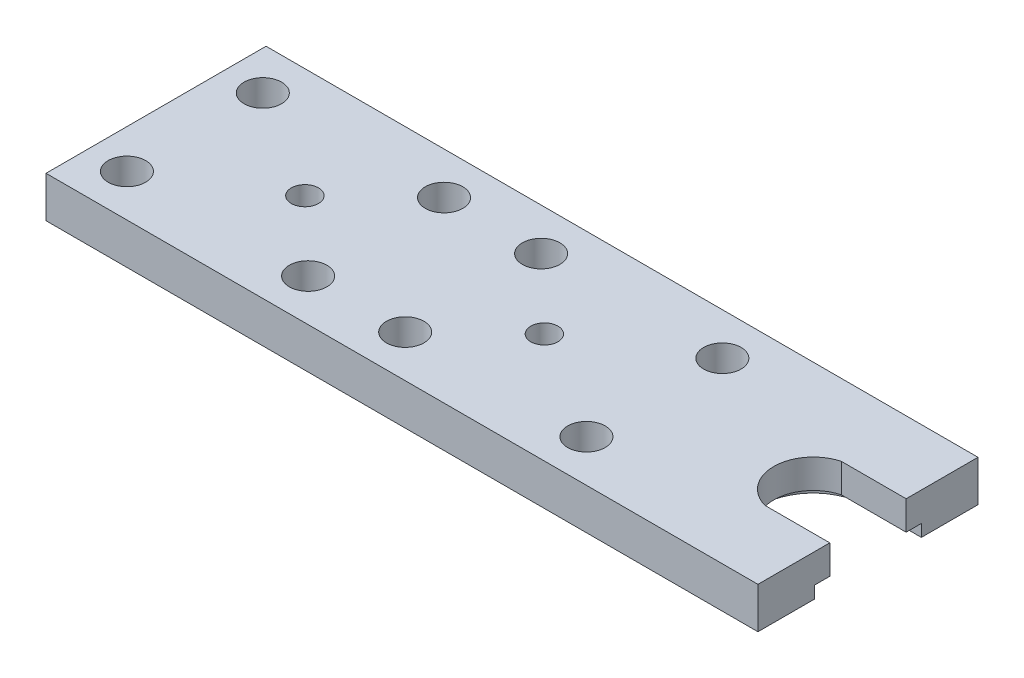
ISO-10303-21;
HEADER;
FILE_DESCRIPTION(('STEP AP214'),'2;1');
FILE_NAME('part.step','',(''),(''),'','','');
FILE_SCHEMA(('AUTOMOTIVE_DESIGN { 1 0 10303 214 1 1 1 1 }'));
ENDSEC;
DATA;
#1=APPLICATION_CONTEXT('core data for automotive mechanical design processes');
#2=APPLICATION_PROTOCOL_DEFINITION('international standard','automotive_design',2000,#1);
#3=PRODUCT_CONTEXT('',#1,'mechanical');
#4=PRODUCT('Part','Part','',(#3));
#5=PRODUCT_RELATED_PRODUCT_CATEGORY('part','',(#4));
#6=PRODUCT_DEFINITION_FORMATION('','',#4);
#7=PRODUCT_DEFINITION_CONTEXT('part definition',#1,'design');
#8=PRODUCT_DEFINITION('design','',#6,#7);
#9=PRODUCT_DEFINITION_SHAPE('','',#8);
#10=(LENGTH_UNIT() NAMED_UNIT(*) SI_UNIT(.MILLI.,.METRE.));
#11=(NAMED_UNIT(*) PLANE_ANGLE_UNIT() SI_UNIT($,.RADIAN.));
#12=(NAMED_UNIT(*) SI_UNIT($,.STERADIAN.) SOLID_ANGLE_UNIT());
#13=UNCERTAINTY_MEASURE_WITH_UNIT(LENGTH_MEASURE(1.E-05),#10,'distance_accuracy_value','');
#14=(GEOMETRIC_REPRESENTATION_CONTEXT(3) GLOBAL_UNCERTAINTY_ASSIGNED_CONTEXT((#13)) GLOBAL_UNIT_ASSIGNED_CONTEXT((#10,
#11,#12)) REPRESENTATION_CONTEXT('',''));
#15=CARTESIAN_POINT('',(0.,0.,0.));
#16=DIRECTION('',(0.,0.,1.));
#17=DIRECTION('',(1.,0.,0.));
#18=AXIS2_PLACEMENT_3D('',#15,#16,#17);
#19=CARTESIAN_POINT('',(68.5,6.35,-1.));
#20=DIRECTION('',(1.,0.,0.));
#21=DIRECTION('',(0.,0.,-1.));
#22=AXIS2_PLACEMENT_3D('',#19,#20,#21);
#23=PLANE('',#22);
#24=DIRECTION('',(0.,0.,1.));
#25=VECTOR('',#24,1.);
#26=CARTESIAN_POINT('',(68.5,0.,-1.));
#27=LINE('',#26,#25);
#28=CARTESIAN_POINT('',(68.5,0.,24.25));
#29=VERTEX_POINT('',#28);
#30=CARTESIAN_POINT('',(68.5,0.,33.));
#31=VERTEX_POINT('',#30);
#32=EDGE_CURVE('E264',#29,#31,#27,.T.);
#33=ORIENTED_EDGE('',*,*,#32,.F.);
#34=DIRECTION('',(0.,-1.,0.));
#35=VECTOR('',#34,1.);
#36=CARTESIAN_POINT('',(68.5,1.87,24.25));
#37=LINE('',#36,#35);
#38=CARTESIAN_POINT('',(68.5,1.87,24.25));
#39=VERTEX_POINT('',#38);
#40=EDGE_CURVE('E161',#39,#29,#37,.T.);
#41=ORIENTED_EDGE('',*,*,#40,.F.);
#42=DIRECTION('',(0.,0.,-1.));
#43=VECTOR('',#42,1.);
#44=CARTESIAN_POINT('',(68.5,1.87,7.75000000000001));
#45=LINE('',#44,#43);
#46=CARTESIAN_POINT('',(68.5,1.87,21.9));
#47=VERTEX_POINT('',#46);
#48=EDGE_CURVE('E134',#39,#47,#45,.T.);
#49=ORIENTED_EDGE('',*,*,#48,.T.);
#50=DIRECTION('',(0.,1.,0.));
#51=VECTOR('',#50,1.);
#52=CARTESIAN_POINT('',(68.5,0.,21.9));
#53=LINE('',#52,#51);
#54=CARTESIAN_POINT('',(68.5,6.35,21.9));
#55=VERTEX_POINT('',#54);
#56=EDGE_CURVE('E181',#47,#55,#53,.T.);
#57=ORIENTED_EDGE('',*,*,#56,.T.);
#58=DIRECTION('',(0.,0.,1.));
#59=VECTOR('',#58,1.);
#60=CARTESIAN_POINT('',(68.5,6.35,-1.));
#61=LINE('',#60,#59);
#62=CARTESIAN_POINT('',(68.5,6.35,33.));
#63=VERTEX_POINT('',#62);
#64=EDGE_CURVE('E254',#55,#63,#61,.T.);
#65=ORIENTED_EDGE('',*,*,#64,.T.);
#66=DIRECTION('',(0.,-1.,0.));
#67=VECTOR('',#66,1.);
#68=CARTESIAN_POINT('',(68.5,6.35,33.));
#69=LINE('',#68,#67);
#70=EDGE_CURVE('E270',#63,#31,#69,.T.);
#71=ORIENTED_EDGE('',*,*,#70,.T.);
#72=EDGE_LOOP('',(#33,#41,#49,#57,#65,#71));
#73=FACE_BOUND('',#72,.T.);
#74=ADVANCED_FACE('F33',(#73),#23,.T.);
#75=CARTESIAN_POINT('',(68.5,1.87,10.1));
#76=VERTEX_POINT('',#75);
#77=CARTESIAN_POINT('',(68.5,1.87,7.75000000000001));
#78=VERTEX_POINT('',#77);
#79=EDGE_CURVE('E47',#76,#78,#45,.T.);
#80=ORIENTED_EDGE('',*,*,#79,.T.);
#81=DIRECTION('',(0.,-1.,0.));
#82=VECTOR('',#81,1.);
#83=CARTESIAN_POINT('',(68.5,1.87,7.75000000000001));
#84=LINE('',#83,#82);
#85=CARTESIAN_POINT('',(68.5,0.,7.75000000000001));
#86=VERTEX_POINT('',#85);
#87=EDGE_CURVE('E137',#78,#86,#84,.T.);
#88=ORIENTED_EDGE('',*,*,#87,.T.);
#89=CARTESIAN_POINT('',(68.5,0.,-1.));
#90=VERTEX_POINT('',#89);
#91=EDGE_CURVE('E265',#90,#86,#27,.T.);
#92=ORIENTED_EDGE('',*,*,#91,.F.);
#93=DIRECTION('',(0.,-1.,0.));
#94=VECTOR('',#93,1.);
#95=CARTESIAN_POINT('',(68.5,6.35,-1.));
#96=LINE('',#95,#94);
#97=CARTESIAN_POINT('',(68.5,6.35,-1.));
#98=VERTEX_POINT('',#97);
#99=EDGE_CURVE('E273',#98,#90,#96,.T.);
#100=ORIENTED_EDGE('',*,*,#99,.F.);
#101=CARTESIAN_POINT('',(68.5,6.35,10.1));
#102=VERTEX_POINT('',#101);
#103=EDGE_CURVE('E255',#98,#102,#61,.T.);
#104=ORIENTED_EDGE('',*,*,#103,.T.);
#105=DIRECTION('',(0.,1.,0.));
#106=VECTOR('',#105,1.);
#107=CARTESIAN_POINT('',(68.5,0.,10.1));
#108=LINE('',#107,#106);
#109=EDGE_CURVE('E150',#76,#102,#108,.T.);
#110=ORIENTED_EDGE('',*,*,#109,.F.);
#111=EDGE_LOOP('',(#80,#88,#92,#100,#104,#110));
#112=FACE_BOUND('',#111,.T.);
#113=ADVANCED_FACE('F148',(#112),#23,.T.);
#114=CARTESIAN_POINT('',(0.,0.,0.));
#115=DIRECTION('',(0.,-1.,0.));
#116=DIRECTION('',(0.,0.,-1.));
#117=AXIS2_PLACEMENT_3D('',#114,#115,#116);
#118=PLANE('',#117);
#119=CARTESIAN_POINT('',(35.5,0.,26.5));
#120=DIRECTION('',(0.,1.,0.));
#121=DIRECTION('',(0.,0.,1.));
#122=AXIS2_PLACEMENT_3D('',#119,#120,#121);
#123=CIRCLE('',#122,2.89999999999999);
#124=CARTESIAN_POINT('',(35.5,0.,29.4));
#125=VERTEX_POINT('',#124);
#126=EDGE_CURVE('E245',#125,#125,#123,.T.);
#127=ORIENTED_EDGE('',*,*,#126,.T.);
#128=EDGE_LOOP('',(#127));
#129=FACE_BOUND('',#128,.T.);
#130=CARTESIAN_POINT('',(7.49999999999999,0.,26.5));
#131=DIRECTION('',(0.,1.,0.));
#132=DIRECTION('',(0.,0.,1.));
#133=AXIS2_PLACEMENT_3D('',#130,#131,#132);
#134=CIRCLE('',#133,2.89999999999999);
#135=CARTESIAN_POINT('',(7.49999999999999,0.,29.4));
#136=VERTEX_POINT('',#135);
#137=EDGE_CURVE('E239',#136,#136,#134,.T.);
#138=ORIENTED_EDGE('',*,*,#137,.T.);
#139=EDGE_LOOP('',(#138));
#140=FACE_BOUND('',#139,.T.);
#141=CARTESIAN_POINT('',(-7.50000000000001,0.,26.5));
#142=DIRECTION('',(0.,1.,0.));
#143=DIRECTION('',(0.,0.,1.));
#144=AXIS2_PLACEMENT_3D('',#141,#142,#143);
#145=CIRCLE('',#144,2.89999999999999);
#146=CARTESIAN_POINT('',(-7.50000000000001,0.,29.4));
#147=VERTEX_POINT('',#146);
#148=EDGE_CURVE('E233',#147,#147,#145,.T.);
#149=ORIENTED_EDGE('',*,*,#148,.T.);
#150=EDGE_LOOP('',(#149));
#151=FACE_BOUND('',#150,.T.);
#152=CARTESIAN_POINT('',(-35.5,0.,26.5));
#153=DIRECTION('',(0.,1.,0.));
#154=DIRECTION('',(0.,0.,1.));
#155=AXIS2_PLACEMENT_3D('',#152,#153,#154);
#156=CIRCLE('',#155,2.89999999999999);
#157=CARTESIAN_POINT('',(-35.5,0.,29.4));
#158=VERTEX_POINT('',#157);
#159=EDGE_CURVE('E227',#158,#158,#156,.T.);
#160=ORIENTED_EDGE('',*,*,#159,.T.);
#161=EDGE_LOOP('',(#160));
#162=FACE_BOUND('',#161,.T.);
#163=CARTESIAN_POINT('',(35.5,0.,5.5));
#164=DIRECTION('',(0.,1.,0.));
#165=DIRECTION('',(0.,0.,1.));
#166=AXIS2_PLACEMENT_3D('',#163,#164,#165);
#167=CIRCLE('',#166,2.89999999999999);
#168=CARTESIAN_POINT('',(35.5,0.,8.4));
#169=VERTEX_POINT('',#168);
#170=EDGE_CURVE('E221',#169,#169,#167,.T.);
#171=ORIENTED_EDGE('',*,*,#170,.T.);
#172=EDGE_LOOP('',(#171));
#173=FACE_BOUND('',#172,.T.);
#174=CARTESIAN_POINT('',(7.49999999999999,0.,5.5));
#175=DIRECTION('',(0.,1.,0.));
#176=DIRECTION('',(0.,0.,1.));
#177=AXIS2_PLACEMENT_3D('',#174,#175,#176);
#178=CIRCLE('',#177,2.89999999999999);
#179=CARTESIAN_POINT('',(7.49999999999999,0.,8.4));
#180=VERTEX_POINT('',#179);
#181=EDGE_CURVE('E215',#180,#180,#178,.T.);
#182=ORIENTED_EDGE('',*,*,#181,.T.);
#183=EDGE_LOOP('',(#182));
#184=FACE_BOUND('',#183,.T.);
#185=CARTESIAN_POINT('',(-7.50000000000001,0.,5.5));
#186=DIRECTION('',(0.,1.,0.));
#187=DIRECTION('',(0.,0.,1.));
#188=AXIS2_PLACEMENT_3D('',#185,#186,#187);
#189=CIRCLE('',#188,2.89999999999999);
#190=CARTESIAN_POINT('',(-7.50000000000001,0.,8.4));
#191=VERTEX_POINT('',#190);
#192=EDGE_CURVE('E209',#191,#191,#189,.T.);
#193=ORIENTED_EDGE('',*,*,#192,.T.);
#194=EDGE_LOOP('',(#193));
#195=FACE_BOUND('',#194,.T.);
#196=CARTESIAN_POINT('',(-35.5,0.,5.5));
#197=DIRECTION('',(0.,1.,0.));
#198=DIRECTION('',(0.,0.,1.));
#199=AXIS2_PLACEMENT_3D('',#196,#197,#198);
#200=CIRCLE('',#199,2.89999999999999);
#201=CARTESIAN_POINT('',(-35.5,0.,8.39999999999999));
#202=VERTEX_POINT('',#201);
#203=EDGE_CURVE('E203',#202,#202,#200,.T.);
#204=ORIENTED_EDGE('',*,*,#203,.T.);
#205=EDGE_LOOP('',(#204));
#206=FACE_BOUND('',#205,.T.);
#207=CARTESIAN_POINT('',(18.5,0.,16.));
#208=DIRECTION('',(0.,1.,0.));
#209=DIRECTION('',(0.,0.,1.));
#210=AXIS2_PLACEMENT_3D('',#207,#208,#209);
#211=CIRCLE('',#210,2.09999999999999);
#212=CARTESIAN_POINT('',(18.5,0.,18.1));
#213=VERTEX_POINT('',#212);
#214=EDGE_CURVE('E197',#213,#213,#211,.T.);
#215=ORIENTED_EDGE('',*,*,#214,.T.);
#216=EDGE_LOOP('',(#215));
#217=FACE_BOUND('',#216,.T.);
#218=CARTESIAN_POINT('',(-18.5,0.,16.));
#219=DIRECTION('',(0.,1.,0.));
#220=DIRECTION('',(0.,0.,1.));
#221=AXIS2_PLACEMENT_3D('',#218,#219,#220);
#222=CIRCLE('',#221,2.09999999999999);
#223=CARTESIAN_POINT('',(-18.5,0.,18.1));
#224=VERTEX_POINT('',#223);
#225=EDGE_CURVE('E191',#224,#224,#222,.T.);
#226=ORIENTED_EDGE('',*,*,#225,.T.);
#227=EDGE_LOOP('',(#226));
#228=FACE_BOUND('',#227,.T.);
#229=ORIENTED_EDGE('',*,*,#91,.T.);
#230=DIRECTION('',(-1.,0.,0.));
#231=VECTOR('',#230,1.);
#232=CARTESIAN_POINT('',(68.5,0.,7.75000000000001));
#233=LINE('',#232,#231);
#234=CARTESIAN_POINT('',(60.049193338483,0.,7.75000000000001));
#235=VERTEX_POINT('',#234);
#236=EDGE_CURVE('E140',#86,#235,#233,.T.);
#237=ORIENTED_EDGE('',*,*,#236,.T.);
#238=CARTESIAN_POINT('',(60.049193338483,0.,16.));
#239=DIRECTION('',(0.,1.,0.));
#240=DIRECTION('',(0.,0.,-1.));
#241=AXIS2_PLACEMENT_3D('',#238,#239,#240);
#242=CIRCLE('',#241,8.25);
#243=CARTESIAN_POINT('',(60.049193338483,0.,24.25));
#244=VERTEX_POINT('',#243);
#245=EDGE_CURVE('E155',#235,#244,#242,.T.);
#246=ORIENTED_EDGE('',*,*,#245,.T.);
#247=DIRECTION('',(1.,0.,0.));
#248=VECTOR('',#247,1.);
#249=CARTESIAN_POINT('',(68.5,0.,24.25));
#250=LINE('',#249,#248);
#251=EDGE_CURVE('E151',#244,#29,#250,.T.);
#252=ORIENTED_EDGE('',*,*,#251,.T.);
#253=ORIENTED_EDGE('',*,*,#32,.T.);
#254=DIRECTION('',(-1.,0.,0.));
#255=VECTOR('',#254,1.);
#256=CARTESIAN_POINT('',(68.5,0.,33.));
#257=LINE('',#256,#255);
#258=CARTESIAN_POINT('',(-41.5,0.,33.));
#259=VERTEX_POINT('',#258);
#260=EDGE_CURVE('E252',#31,#259,#257,.T.);
#261=ORIENTED_EDGE('',*,*,#260,.T.);
#262=DIRECTION('',(0.,0.,-1.));
#263=VECTOR('',#262,1.);
#264=CARTESIAN_POINT('',(-41.5,0.,33.));
#265=LINE('',#264,#263);
#266=CARTESIAN_POINT('',(-41.5,0.,-1.));
#267=VERTEX_POINT('',#266);
#268=EDGE_CURVE('E248',#259,#267,#265,.T.);
#269=ORIENTED_EDGE('',*,*,#268,.T.);
#270=DIRECTION('',(1.,0.,0.));
#271=VECTOR('',#270,1.);
#272=CARTESIAN_POINT('',(-41.5,0.,-1.));
#273=LINE('',#272,#271);
#274=EDGE_CURVE('E261',#267,#90,#273,.T.);
#275=ORIENTED_EDGE('',*,*,#274,.T.);
#276=EDGE_LOOP('',(#229,#237,#246,#252,#253,#261,#269,#275));
#277=FACE_BOUND('',#276,.T.);
#278=ADVANCED_FACE('F276',(#129,#140,#151,#162,#173,#184,#195,#206,#217,#228,#277),#118,.T.);
#279=CARTESIAN_POINT('',(68.5,0.,21.9));
#280=DIRECTION('',(0.,0.,1.));
#281=DIRECTION('',(1.,0.,0.));
#282=AXIS2_PLACEMENT_3D('',#279,#280,#281);
#283=PLANE('',#282);
#284=DIRECTION('',(1.,0.,0.));
#285=VECTOR('',#284,1.);
#286=CARTESIAN_POINT('',(68.5,1.87,21.9));
#287=LINE('',#286,#285);
#288=CARTESIAN_POINT('',(58.5,1.87,21.9));
#289=VERTEX_POINT('',#288);
#290=EDGE_CURVE('E170',#289,#47,#287,.T.);
#291=ORIENTED_EDGE('',*,*,#290,.F.);
#292=DIRECTION('',(0.,1.,0.));
#293=VECTOR('',#292,1.);
#294=CARTESIAN_POINT('',(58.5,0.,21.9));
#295=LINE('',#294,#293);
#296=CARTESIAN_POINT('',(58.5,6.35,21.9));
#297=VERTEX_POINT('',#296);
#298=EDGE_CURVE('E184',#289,#297,#295,.T.);
#299=ORIENTED_EDGE('',*,*,#298,.T.);
#300=DIRECTION('',(1.,0.,0.));
#301=VECTOR('',#300,1.);
#302=CARTESIAN_POINT('',(68.5,6.35,21.9));
#303=LINE('',#302,#301);
#304=EDGE_CURVE('E178',#297,#55,#303,.T.);
#305=ORIENTED_EDGE('',*,*,#304,.T.);
#306=ORIENTED_EDGE('',*,*,#56,.F.);
#307=EDGE_LOOP('',(#291,#299,#305,#306));
#308=FACE_BOUND('',#307,.T.);
#309=ADVANCED_FACE('F301',(#308),#283,.F.);
#310=CARTESIAN_POINT('',(60.049193338483,0.,16.));
#311=DIRECTION('',(0.,1.,0.));
#312=DIRECTION('',(0.,0.,1.));
#313=AXIS2_PLACEMENT_3D('',#310,#311,#312);
#314=CYLINDRICAL_SURFACE('',#313,6.1);
#315=CARTESIAN_POINT('',(60.049193338483,1.87,16.));
#316=DIRECTION('',(0.,-1.,0.));
#317=DIRECTION('',(0.,0.,-1.));
#318=AXIS2_PLACEMENT_3D('',#315,#316,#317);
#319=CIRCLE('',#318,6.1);
#320=CARTESIAN_POINT('',(58.5,1.87,10.1));
#321=VERTEX_POINT('',#320);
#322=EDGE_CURVE('E144',#321,#289,#319,.F.);
#323=ORIENTED_EDGE('',*,*,#322,.F.);
#324=DIRECTION('',(0.,1.,0.));
#325=VECTOR('',#324,1.);
#326=CARTESIAN_POINT('',(58.5,0.,10.1));
#327=LINE('',#326,#325);
#328=CARTESIAN_POINT('',(58.5,6.35,10.1));
#329=VERTEX_POINT('',#328);
#330=EDGE_CURVE('E186',#321,#329,#327,.T.);
#331=ORIENTED_EDGE('',*,*,#330,.T.);
#332=CARTESIAN_POINT('',(60.049193338483,6.35,16.));
#333=DIRECTION('',(0.,1.,0.));
#334=DIRECTION('',(0.,0.,1.));
#335=AXIS2_PLACEMENT_3D('',#332,#333,#334);
#336=CIRCLE('',#335,6.1);
#337=EDGE_CURVE('E175',#329,#297,#336,.T.);
#338=ORIENTED_EDGE('',*,*,#337,.T.);
#339=ORIENTED_EDGE('',*,*,#298,.F.);
#340=EDGE_LOOP('',(#323,#331,#338,#339));
#341=FACE_BOUND('',#340,.T.);
#342=ADVANCED_FACE('F305',(#341),#314,.F.);
#343=CARTESIAN_POINT('',(68.5,0.,10.1));
#344=DIRECTION('',(0.,0.,-1.));
#345=DIRECTION('',(-1.,0.,0.));
#346=AXIS2_PLACEMENT_3D('',#343,#344,#345);
#347=PLANE('',#346);
#348=DIRECTION('',(-1.,0.,0.));
#349=VECTOR('',#348,1.);
#350=CARTESIAN_POINT('',(68.5,1.87,10.1));
#351=LINE('',#350,#349);
#352=EDGE_CURVE('E11',#76,#321,#351,.T.);
#353=ORIENTED_EDGE('',*,*,#352,.F.);
#354=ORIENTED_EDGE('',*,*,#109,.T.);
#355=DIRECTION('',(-1.,0.,0.));
#356=VECTOR('',#355,1.);
#357=CARTESIAN_POINT('',(68.5,6.35,10.1));
#358=LINE('',#357,#356);
#359=EDGE_CURVE('E172',#102,#329,#358,.T.);
#360=ORIENTED_EDGE('',*,*,#359,.T.);
#361=ORIENTED_EDGE('',*,*,#330,.F.);
#362=EDGE_LOOP('',(#353,#354,#360,#361));
#363=FACE_BOUND('',#362,.T.);
#364=ADVANCED_FACE('F308',(#363),#347,.F.);
#365=CARTESIAN_POINT('',(-41.5,6.35,33.));
#366=DIRECTION('',(-1.,0.,0.));
#367=DIRECTION('',(0.,0.,1.));
#368=AXIS2_PLACEMENT_3D('',#365,#366,#367);
#369=PLANE('',#368);
#370=ORIENTED_EDGE('',*,*,#268,.F.);
#371=DIRECTION('',(0.,-1.,0.));
#372=VECTOR('',#371,1.);
#373=CARTESIAN_POINT('',(-41.5,6.35,33.));
#374=LINE('',#373,#372);
#375=CARTESIAN_POINT('',(-41.5,6.35,33.));
#376=VERTEX_POINT('',#375);
#377=EDGE_CURVE('E41',#376,#259,#374,.T.);
#378=ORIENTED_EDGE('',*,*,#377,.F.);
#379=DIRECTION('',(0.,0.,-1.));
#380=VECTOR('',#379,1.);
#381=CARTESIAN_POINT('',(-41.5,6.35,33.));
#382=LINE('',#381,#380);
#383=CARTESIAN_POINT('',(-41.5,6.35,-1.));
#384=VERTEX_POINT('',#383);
#385=EDGE_CURVE('E249',#376,#384,#382,.T.);
#386=ORIENTED_EDGE('',*,*,#385,.T.);
#387=DIRECTION('',(0.,-1.,0.));
#388=VECTOR('',#387,1.);
#389=CARTESIAN_POINT('',(-41.5,6.35,-1.));
#390=LINE('',#389,#388);
#391=EDGE_CURVE('E81',#384,#267,#390,.T.);
#392=ORIENTED_EDGE('',*,*,#391,.T.);
#393=EDGE_LOOP('',(#370,#378,#386,#392));
#394=FACE_BOUND('',#393,.T.);
#395=ADVANCED_FACE('F35',(#394),#369,.T.);
#396=CARTESIAN_POINT('',(68.5,6.35,33.));
#397=DIRECTION('',(0.,0.,1.));
#398=DIRECTION('',(1.,0.,0.));
#399=AXIS2_PLACEMENT_3D('',#396,#397,#398);
#400=PLANE('',#399);
#401=ORIENTED_EDGE('',*,*,#260,.F.);
#402=ORIENTED_EDGE('',*,*,#70,.F.);
#403=DIRECTION('',(-1.,0.,0.));
#404=VECTOR('',#403,1.);
#405=CARTESIAN_POINT('',(68.5,6.35,33.));
#406=LINE('',#405,#404);
#407=EDGE_CURVE('E257',#63,#376,#406,.T.);
#408=ORIENTED_EDGE('',*,*,#407,.T.);
#409=ORIENTED_EDGE('',*,*,#377,.T.);
#410=EDGE_LOOP('',(#401,#402,#408,#409));
#411=FACE_BOUND('',#410,.T.);
#412=ADVANCED_FACE('F279',(#411),#400,.T.);
#413=CARTESIAN_POINT('',(-41.5,6.35,-1.));
#414=DIRECTION('',(0.,0.,-1.));
#415=DIRECTION('',(-1.,0.,0.));
#416=AXIS2_PLACEMENT_3D('',#413,#414,#415);
#417=PLANE('',#416);
#418=ORIENTED_EDGE('',*,*,#274,.F.);
#419=ORIENTED_EDGE('',*,*,#391,.F.);
#420=DIRECTION('',(1.,0.,0.));
#421=VECTOR('',#420,1.);
#422=CARTESIAN_POINT('',(-41.5,6.35,-1.));
#423=LINE('',#422,#421);
#424=EDGE_CURVE('E251',#384,#98,#423,.T.);
#425=ORIENTED_EDGE('',*,*,#424,.T.);
#426=ORIENTED_EDGE('',*,*,#99,.T.);
#427=EDGE_LOOP('',(#418,#419,#425,#426));
#428=FACE_BOUND('',#427,.T.);
#429=ADVANCED_FACE('F274',(#428),#417,.T.);
#430=CARTESIAN_POINT('',(0.,6.35,0.));
#431=DIRECTION('',(0.,-1.,0.));
#432=DIRECTION('',(0.,0.,-1.));
#433=AXIS2_PLACEMENT_3D('',#430,#431,#432);
#434=PLANE('',#433);
#435=CARTESIAN_POINT('',(-18.5,6.35,16.));
#436=DIRECTION('',(0.,1.,0.));
#437=DIRECTION('',(0.,0.,1.));
#438=AXIS2_PLACEMENT_3D('',#435,#436,#437);
#439=CIRCLE('',#438,2.09999999999999);
#440=CARTESIAN_POINT('',(-18.5,6.35,18.1));
#441=VERTEX_POINT('',#440);
#442=EDGE_CURVE('E183',#441,#441,#439,.T.);
#443=ORIENTED_EDGE('',*,*,#442,.F.);
#444=EDGE_LOOP('',(#443));
#445=FACE_BOUND('',#444,.T.);
#446=CARTESIAN_POINT('',(18.5,6.35,16.));
#447=DIRECTION('',(0.,1.,0.));
#448=DIRECTION('',(0.,0.,1.));
#449=AXIS2_PLACEMENT_3D('',#446,#447,#448);
#450=CIRCLE('',#449,2.09999999999999);
#451=CARTESIAN_POINT('',(18.5,6.35,18.1));
#452=VERTEX_POINT('',#451);
#453=EDGE_CURVE('E194',#452,#452,#450,.T.);
#454=ORIENTED_EDGE('',*,*,#453,.F.);
#455=EDGE_LOOP('',(#454));
#456=FACE_BOUND('',#455,.T.);
#457=CARTESIAN_POINT('',(-35.5,6.35,5.5));
#458=DIRECTION('',(0.,1.,0.));
#459=DIRECTION('',(0.,0.,1.));
#460=AXIS2_PLACEMENT_3D('',#457,#458,#459);
#461=CIRCLE('',#460,2.89999999999999);
#462=CARTESIAN_POINT('',(-35.5,6.35,8.39999999999998));
#463=VERTEX_POINT('',#462);
#464=EDGE_CURVE('E200',#463,#463,#461,.T.);
#465=ORIENTED_EDGE('',*,*,#464,.F.);
#466=EDGE_LOOP('',(#465));
#467=FACE_BOUND('',#466,.T.);
#468=CARTESIAN_POINT('',(-7.50000000000001,6.35,5.5));
#469=DIRECTION('',(0.,1.,0.));
#470=DIRECTION('',(0.,0.,1.));
#471=AXIS2_PLACEMENT_3D('',#468,#469,#470);
#472=CIRCLE('',#471,2.89999999999999);
#473=CARTESIAN_POINT('',(-7.50000000000001,6.35,8.39999999999999));
#474=VERTEX_POINT('',#473);
#475=EDGE_CURVE('E206',#474,#474,#472,.T.);
#476=ORIENTED_EDGE('',*,*,#475,.F.);
#477=EDGE_LOOP('',(#476));
#478=FACE_BOUND('',#477,.T.);
#479=CARTESIAN_POINT('',(7.49999999999999,6.35,5.5));
#480=DIRECTION('',(0.,1.,0.));
#481=DIRECTION('',(0.,0.,1.));
#482=AXIS2_PLACEMENT_3D('',#479,#480,#481);
#483=CIRCLE('',#482,2.89999999999999);
#484=CARTESIAN_POINT('',(7.49999999999999,6.35,8.39999999999999));
#485=VERTEX_POINT('',#484);
#486=EDGE_CURVE('E212',#485,#485,#483,.T.);
#487=ORIENTED_EDGE('',*,*,#486,.F.);
#488=EDGE_LOOP('',(#487));
#489=FACE_BOUND('',#488,.T.);
#490=CARTESIAN_POINT('',(35.5,6.35,5.5));
#491=DIRECTION('',(0.,1.,0.));
#492=DIRECTION('',(0.,0.,1.));
#493=AXIS2_PLACEMENT_3D('',#490,#491,#492);
#494=CIRCLE('',#493,2.89999999999999);
#495=CARTESIAN_POINT('',(35.5,6.35,8.39999999999999));
#496=VERTEX_POINT('',#495);
#497=EDGE_CURVE('E218',#496,#496,#494,.T.);
#498=ORIENTED_EDGE('',*,*,#497,.F.);
#499=EDGE_LOOP('',(#498));
#500=FACE_BOUND('',#499,.T.);
#501=CARTESIAN_POINT('',(-35.5,6.35,26.5));
#502=DIRECTION('',(0.,1.,0.));
#503=DIRECTION('',(0.,0.,1.));
#504=AXIS2_PLACEMENT_3D('',#501,#502,#503);
#505=CIRCLE('',#504,2.89999999999999);
#506=CARTESIAN_POINT('',(-35.5,6.35,29.4));
#507=VERTEX_POINT('',#506);
#508=EDGE_CURVE('E224',#507,#507,#505,.T.);
#509=ORIENTED_EDGE('',*,*,#508,.F.);
#510=EDGE_LOOP('',(#509));
#511=FACE_BOUND('',#510,.T.);
#512=CARTESIAN_POINT('',(-7.50000000000001,6.35,26.5));
#513=DIRECTION('',(0.,1.,0.));
#514=DIRECTION('',(0.,0.,1.));
#515=AXIS2_PLACEMENT_3D('',#512,#513,#514);
#516=CIRCLE('',#515,2.89999999999999);
#517=CARTESIAN_POINT('',(-7.50000000000001,6.35,29.4));
#518=VERTEX_POINT('',#517);
#519=EDGE_CURVE('E230',#518,#518,#516,.T.);
#520=ORIENTED_EDGE('',*,*,#519,.F.);
#521=EDGE_LOOP('',(#520));
#522=FACE_BOUND('',#521,.T.);
#523=CARTESIAN_POINT('',(7.49999999999999,6.35,26.5));
#524=DIRECTION('',(0.,1.,0.));
#525=DIRECTION('',(0.,0.,1.));
#526=AXIS2_PLACEMENT_3D('',#523,#524,#525);
#527=CIRCLE('',#526,2.89999999999999);
#528=CARTESIAN_POINT('',(7.49999999999999,6.35,29.4));
#529=VERTEX_POINT('',#528);
#530=EDGE_CURVE('E236',#529,#529,#527,.T.);
#531=ORIENTED_EDGE('',*,*,#530,.F.);
#532=EDGE_LOOP('',(#531));
#533=FACE_BOUND('',#532,.T.);
#534=CARTESIAN_POINT('',(35.5,6.35,26.5));
#535=DIRECTION('',(0.,1.,0.));
#536=DIRECTION('',(0.,0.,1.));
#537=AXIS2_PLACEMENT_3D('',#534,#535,#536);
#538=CIRCLE('',#537,2.89999999999999);
#539=CARTESIAN_POINT('',(35.5,6.35,29.4));
#540=VERTEX_POINT('',#539);
#541=EDGE_CURVE('E242',#540,#540,#538,.T.);
#542=ORIENTED_EDGE('',*,*,#541,.F.);
#543=EDGE_LOOP('',(#542));
#544=FACE_BOUND('',#543,.T.);
#545=ORIENTED_EDGE('',*,*,#64,.F.);
#546=ORIENTED_EDGE('',*,*,#304,.F.);
#547=ORIENTED_EDGE('',*,*,#337,.F.);
#548=ORIENTED_EDGE('',*,*,#359,.F.);
#549=ORIENTED_EDGE('',*,*,#103,.F.);
#550=ORIENTED_EDGE('',*,*,#424,.F.);
#551=ORIENTED_EDGE('',*,*,#385,.F.);
#552=ORIENTED_EDGE('',*,*,#407,.F.);
#553=EDGE_LOOP('',(#545,#546,#547,#548,#549,#550,#551,#552));
#554=FACE_BOUND('',#553,.T.);
#555=ADVANCED_FACE('F284',(#445,#456,#467,#478,#489,#500,#511,#522,#533,#544,#554),#434,.F.);
#556=CARTESIAN_POINT('',(35.5,6.35,26.5));
#557=DIRECTION('',(0.,1.,0.));
#558=DIRECTION('',(0.,0.,1.));
#559=AXIS2_PLACEMENT_3D('',#556,#557,#558);
#560=CYLINDRICAL_SURFACE('',#559,2.89999999999999);
#561=ORIENTED_EDGE('',*,*,#126,.F.);
#562=EDGE_LOOP('',(#561));
#563=FACE_BOUND('',#562,.T.);
#564=ORIENTED_EDGE('',*,*,#541,.T.);
#565=EDGE_LOOP('',(#564));
#566=FACE_BOUND('',#565,.T.);
#567=ADVANCED_FACE('F329',(#563,#566),#560,.F.);
#568=CARTESIAN_POINT('',(7.49999999999999,6.35,26.5));
#569=DIRECTION('',(0.,1.,0.));
#570=DIRECTION('',(0.,0.,1.));
#571=AXIS2_PLACEMENT_3D('',#568,#569,#570);
#572=CYLINDRICAL_SURFACE('',#571,2.89999999999999);
#573=ORIENTED_EDGE('',*,*,#137,.F.);
#574=EDGE_LOOP('',(#573));
#575=FACE_BOUND('',#574,.T.);
#576=ORIENTED_EDGE('',*,*,#530,.T.);
#577=EDGE_LOOP('',(#576));
#578=FACE_BOUND('',#577,.T.);
#579=ADVANCED_FACE('F360',(#575,#578),#572,.F.);
#580=CARTESIAN_POINT('',(-7.50000000000001,6.35,26.5));
#581=DIRECTION('',(0.,1.,0.));
#582=DIRECTION('',(0.,0.,1.));
#583=AXIS2_PLACEMENT_3D('',#580,#581,#582);
#584=CYLINDRICAL_SURFACE('',#583,2.89999999999999);
#585=ORIENTED_EDGE('',*,*,#148,.F.);
#586=EDGE_LOOP('',(#585));
#587=FACE_BOUND('',#586,.T.);
#588=ORIENTED_EDGE('',*,*,#519,.T.);
#589=EDGE_LOOP('',(#588));
#590=FACE_BOUND('',#589,.T.);
#591=ADVANCED_FACE('F369',(#587,#590),#584,.F.);
#592=CARTESIAN_POINT('',(-35.5,6.35,26.5));
#593=DIRECTION('',(0.,1.,0.));
#594=DIRECTION('',(0.,0.,1.));
#595=AXIS2_PLACEMENT_3D('',#592,#593,#594);
#596=CYLINDRICAL_SURFACE('',#595,2.89999999999999);
#597=ORIENTED_EDGE('',*,*,#159,.F.);
#598=EDGE_LOOP('',(#597));
#599=FACE_BOUND('',#598,.T.);
#600=ORIENTED_EDGE('',*,*,#508,.T.);
#601=EDGE_LOOP('',(#600));
#602=FACE_BOUND('',#601,.T.);
#603=ADVANCED_FACE('F378',(#599,#602),#596,.F.);
#604=CARTESIAN_POINT('',(35.5,6.35,5.5));
#605=DIRECTION('',(0.,1.,0.));
#606=DIRECTION('',(0.,0.,1.));
#607=AXIS2_PLACEMENT_3D('',#604,#605,#606);
#608=CYLINDRICAL_SURFACE('',#607,2.89999999999999);
#609=ORIENTED_EDGE('',*,*,#170,.F.);
#610=EDGE_LOOP('',(#609));
#611=FACE_BOUND('',#610,.T.);
#612=ORIENTED_EDGE('',*,*,#497,.T.);
#613=EDGE_LOOP('',(#612));
#614=FACE_BOUND('',#613,.T.);
#615=ADVANCED_FACE('F387',(#611,#614),#608,.F.);
#616=CARTESIAN_POINT('',(7.49999999999999,6.35,5.5));
#617=DIRECTION('',(0.,1.,0.));
#618=DIRECTION('',(0.,0.,1.));
#619=AXIS2_PLACEMENT_3D('',#616,#617,#618);
#620=CYLINDRICAL_SURFACE('',#619,2.89999999999999);
#621=ORIENTED_EDGE('',*,*,#181,.F.);
#622=EDGE_LOOP('',(#621));
#623=FACE_BOUND('',#622,.T.);
#624=ORIENTED_EDGE('',*,*,#486,.T.);
#625=EDGE_LOOP('',(#624));
#626=FACE_BOUND('',#625,.T.);
#627=ADVANCED_FACE('F396',(#623,#626),#620,.F.);
#628=CARTESIAN_POINT('',(-7.50000000000001,6.35,5.5));
#629=DIRECTION('',(0.,1.,0.));
#630=DIRECTION('',(0.,0.,1.));
#631=AXIS2_PLACEMENT_3D('',#628,#629,#630);
#632=CYLINDRICAL_SURFACE('',#631,2.89999999999999);
#633=ORIENTED_EDGE('',*,*,#192,.F.);
#634=EDGE_LOOP('',(#633));
#635=FACE_BOUND('',#634,.T.);
#636=ORIENTED_EDGE('',*,*,#475,.T.);
#637=EDGE_LOOP('',(#636));
#638=FACE_BOUND('',#637,.T.);
#639=ADVANCED_FACE('F405',(#635,#638),#632,.F.);
#640=CARTESIAN_POINT('',(-35.5,6.35,5.5));
#641=DIRECTION('',(0.,1.,0.));
#642=DIRECTION('',(0.,0.,1.));
#643=AXIS2_PLACEMENT_3D('',#640,#641,#642);
#644=CYLINDRICAL_SURFACE('',#643,2.89999999999999);
#645=ORIENTED_EDGE('',*,*,#203,.F.);
#646=EDGE_LOOP('',(#645));
#647=FACE_BOUND('',#646,.T.);
#648=ORIENTED_EDGE('',*,*,#464,.T.);
#649=EDGE_LOOP('',(#648));
#650=FACE_BOUND('',#649,.T.);
#651=ADVANCED_FACE('F414',(#647,#650),#644,.F.);
#652=CARTESIAN_POINT('',(18.5,6.35,16.));
#653=DIRECTION('',(0.,1.,0.));
#654=DIRECTION('',(0.,0.,1.));
#655=AXIS2_PLACEMENT_3D('',#652,#653,#654);
#656=CYLINDRICAL_SURFACE('',#655,2.09999999999999);
#657=ORIENTED_EDGE('',*,*,#214,.F.);
#658=EDGE_LOOP('',(#657));
#659=FACE_BOUND('',#658,.T.);
#660=ORIENTED_EDGE('',*,*,#453,.T.);
#661=EDGE_LOOP('',(#660));
#662=FACE_BOUND('',#661,.T.);
#663=ADVANCED_FACE('F423',(#659,#662),#656,.F.);
#664=CARTESIAN_POINT('',(-18.5,6.35,16.));
#665=DIRECTION('',(0.,1.,0.));
#666=DIRECTION('',(0.,0.,1.));
#667=AXIS2_PLACEMENT_3D('',#664,#665,#666);
#668=CYLINDRICAL_SURFACE('',#667,2.09999999999999);
#669=ORIENTED_EDGE('',*,*,#225,.F.);
#670=EDGE_LOOP('',(#669));
#671=FACE_BOUND('',#670,.T.);
#672=ORIENTED_EDGE('',*,*,#442,.T.);
#673=EDGE_LOOP('',(#672));
#674=FACE_BOUND('',#673,.T.);
#675=ADVANCED_FACE('F432',(#671,#674),#668,.F.);
#676=CARTESIAN_POINT('',(60.049193338483,1.87,16.));
#677=DIRECTION('',(0.,-1.,0.));
#678=DIRECTION('',(0.,0.,-1.));
#679=AXIS2_PLACEMENT_3D('',#676,#677,#678);
#680=PLANE('',#679);
#681=ORIENTED_EDGE('',*,*,#290,.T.);
#682=ORIENTED_EDGE('',*,*,#48,.F.);
#683=DIRECTION('',(1.,0.,0.));
#684=VECTOR('',#683,1.);
#685=CARTESIAN_POINT('',(68.5,1.87,24.25));
#686=LINE('',#685,#684);
#687=CARTESIAN_POINT('',(60.049193338483,1.87,24.25));
#688=VERTEX_POINT('',#687);
#689=EDGE_CURVE('E159',#688,#39,#686,.T.);
#690=ORIENTED_EDGE('',*,*,#689,.F.);
#691=CARTESIAN_POINT('',(60.049193338483,1.87,16.));
#692=DIRECTION('',(0.,1.,0.));
#693=DIRECTION('',(0.,0.,-1.));
#694=AXIS2_PLACEMENT_3D('',#691,#692,#693);
#695=CIRCLE('',#694,8.25);
#696=CARTESIAN_POINT('',(60.049193338483,1.87,7.75000000000001));
#697=VERTEX_POINT('',#696);
#698=EDGE_CURVE('E131',#697,#688,#695,.T.);
#699=ORIENTED_EDGE('',*,*,#698,.F.);
#700=DIRECTION('',(-1.,0.,0.));
#701=VECTOR('',#700,1.);
#702=CARTESIAN_POINT('',(68.5,1.87,7.75000000000001));
#703=LINE('',#702,#701);
#704=EDGE_CURVE('E127',#78,#697,#703,.T.);
#705=ORIENTED_EDGE('',*,*,#704,.F.);
#706=ORIENTED_EDGE('',*,*,#79,.F.);
#707=ORIENTED_EDGE('',*,*,#352,.T.);
#708=ORIENTED_EDGE('',*,*,#322,.T.);
#709=EDGE_LOOP('',(#681,#682,#690,#699,#705,#706,#707,#708));
#710=FACE_BOUND('',#709,.T.);
#711=ADVANCED_FACE('F129',(#710),#680,.T.);
#712=CARTESIAN_POINT('',(68.5,1.87,7.75000000000001));
#713=DIRECTION('',(0.,0.,1.));
#714=DIRECTION('',(1.,0.,0.));
#715=AXIS2_PLACEMENT_3D('',#712,#713,#714);
#716=PLANE('',#715);
#717=ORIENTED_EDGE('',*,*,#236,.F.);
#718=ORIENTED_EDGE('',*,*,#87,.F.);
#719=ORIENTED_EDGE('',*,*,#704,.T.);
#720=DIRECTION('',(0.,-1.,0.));
#721=VECTOR('',#720,1.);
#722=CARTESIAN_POINT('',(60.049193338483,1.87,7.75000000000001));
#723=LINE('',#722,#721);
#724=EDGE_CURVE('E145',#697,#235,#723,.T.);
#725=ORIENTED_EDGE('',*,*,#724,.T.);
#726=EDGE_LOOP('',(#717,#718,#719,#725));
#727=FACE_BOUND('',#726,.T.);
#728=ADVANCED_FACE('F138',(#727),#716,.T.);
#729=CARTESIAN_POINT('',(60.049193338483,1.87,16.));
#730=DIRECTION('',(0.,-1.,0.));
#731=DIRECTION('',(0.,0.,-1.));
#732=AXIS2_PLACEMENT_3D('',#729,#730,#731);
#733=CYLINDRICAL_SURFACE('',#732,8.25);
#734=ORIENTED_EDGE('',*,*,#245,.F.);
#735=ORIENTED_EDGE('',*,*,#724,.F.);
#736=ORIENTED_EDGE('',*,*,#698,.T.);
#737=DIRECTION('',(0.,-1.,0.));
#738=VECTOR('',#737,1.);
#739=CARTESIAN_POINT('',(60.049193338483,1.87,24.25));
#740=LINE('',#739,#738);
#741=EDGE_CURVE('E166',#688,#244,#740,.T.);
#742=ORIENTED_EDGE('',*,*,#741,.T.);
#743=EDGE_LOOP('',(#734,#735,#736,#742));
#744=FACE_BOUND('',#743,.T.);
#745=ADVANCED_FACE('F292',(#744),#733,.F.);
#746=CARTESIAN_POINT('',(68.5,1.87,24.25));
#747=DIRECTION('',(0.,0.,-1.));
#748=DIRECTION('',(-1.,0.,0.));
#749=AXIS2_PLACEMENT_3D('',#746,#747,#748);
#750=PLANE('',#749);
#751=ORIENTED_EDGE('',*,*,#251,.F.);
#752=ORIENTED_EDGE('',*,*,#741,.F.);
#753=ORIENTED_EDGE('',*,*,#689,.T.);
#754=ORIENTED_EDGE('',*,*,#40,.T.);
#755=EDGE_LOOP('',(#751,#752,#753,#754));
#756=FACE_BOUND('',#755,.T.);
#757=ADVANCED_FACE('F295',(#756),#750,.T.);
#758=CLOSED_SHELL('',(#74,#113,#278,#309,#342,#364,#395,#412,#429,#555,#567,#579,#591,#603,#615,
#627,#639,#651,#663,#675,#711,#728,#745,#757));
#759=MANIFOLD_SOLID_BREP('B2',#758);
#760=ADVANCED_BREP_SHAPE_REPRESENTATION('',(#18,#759),#14);
#761=SHAPE_DEFINITION_REPRESENTATION(#9,#760);
ENDSEC;
END-ISO-10303-21;
